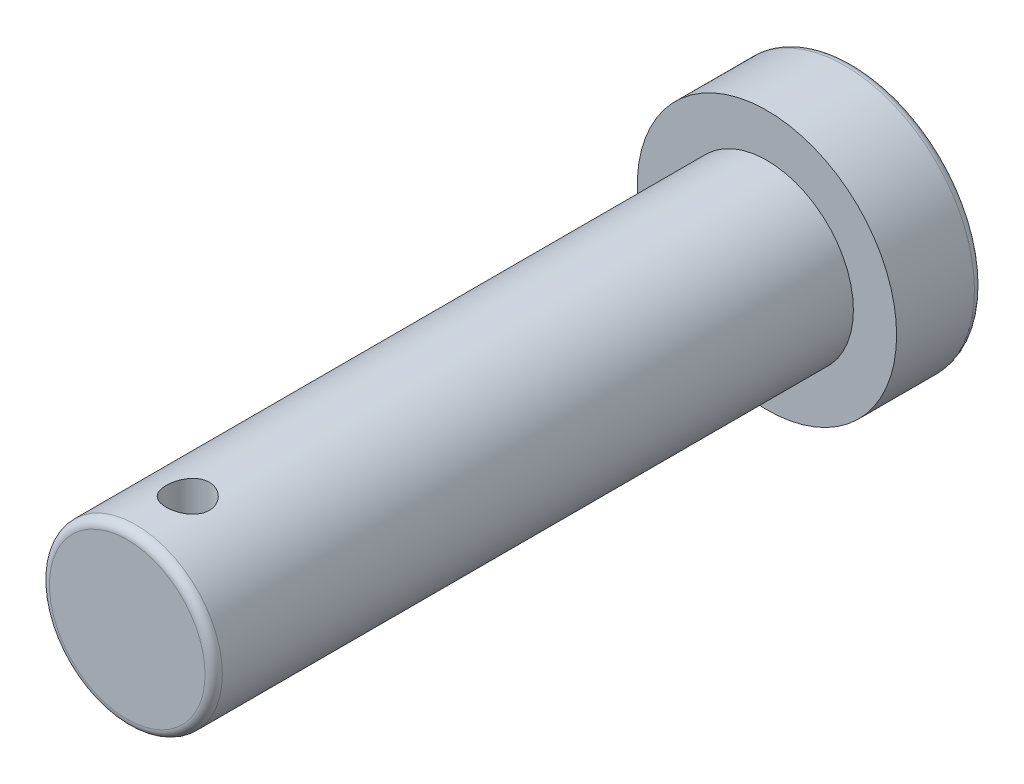
ISO-10303-21;
HEADER;
FILE_DESCRIPTION(('STEP AP214'),'2;1');
FILE_NAME('part.step','',(''),(''),'','','');
FILE_SCHEMA(('AUTOMOTIVE_DESIGN { 1 0 10303 214 1 1 1 1 }'));
ENDSEC;
DATA;
#1=APPLICATION_CONTEXT('core data for automotive mechanical design processes');
#2=APPLICATION_PROTOCOL_DEFINITION('international standard','automotive_design',2000,#1);
#3=PRODUCT_CONTEXT('',#1,'mechanical');
#4=PRODUCT('Part','Part','',(#3));
#5=PRODUCT_RELATED_PRODUCT_CATEGORY('part','',(#4));
#6=PRODUCT_DEFINITION_FORMATION('','',#4);
#7=PRODUCT_DEFINITION_CONTEXT('part definition',#1,'design');
#8=PRODUCT_DEFINITION('design','',#6,#7);
#9=PRODUCT_DEFINITION_SHAPE('','',#8);
#10=(LENGTH_UNIT() NAMED_UNIT(*) SI_UNIT(.MILLI.,.METRE.));
#11=(NAMED_UNIT(*) PLANE_ANGLE_UNIT() SI_UNIT($,.RADIAN.));
#12=(NAMED_UNIT(*) SI_UNIT($,.STERADIAN.) SOLID_ANGLE_UNIT());
#13=UNCERTAINTY_MEASURE_WITH_UNIT(LENGTH_MEASURE(1.E-05),#10,'distance_accuracy_value','');
#14=(GEOMETRIC_REPRESENTATION_CONTEXT(3) GLOBAL_UNCERTAINTY_ASSIGNED_CONTEXT((#13)) GLOBAL_UNIT_ASSIGNED_CONTEXT((#10,
#11,#12)) REPRESENTATION_CONTEXT('',''));
#15=CARTESIAN_POINT('',(0.,0.,0.));
#16=DIRECTION('',(0.,0.,1.));
#17=DIRECTION('',(1.,0.,0.));
#18=AXIS2_PLACEMENT_3D('',#15,#16,#17);
#19=CARTESIAN_POINT('',(0.,0.,84.));
#20=DIRECTION('',(0.,0.,-1.));
#21=DIRECTION('',(-1.,0.,0.));
#22=AXIS2_PLACEMENT_3D('',#19,#20,#21);
#23=CYLINDRICAL_SURFACE('',#22,10.);
#24=CARTESIAN_POINT('',(0.,0.,83.));
#25=DIRECTION('',(0.,0.,1.));
#26=DIRECTION('',(1.,0.,0.));
#27=AXIS2_PLACEMENT_3D('',#24,#25,#26);
#28=CIRCLE('',#27,10.);
#29=CARTESIAN_POINT('',(10.,0.,83.));
#30=VERTEX_POINT('',#29);
#31=EDGE_CURVE('E10',#30,#30,#28,.F.);
#32=ORIENTED_EDGE('',*,*,#31,.T.);
#33=EDGE_LOOP('',(#32));
#34=FACE_BOUND('',#33,.T.);
#35=CARTESIAN_POINT('',(0.,0.,10.));
#36=DIRECTION('',(0.,0.,1.));
#37=DIRECTION('',(1.,0.,0.));
#38=AXIS2_PLACEMENT_3D('',#35,#36,#37);
#39=CIRCLE('',#38,10.);
#40=CARTESIAN_POINT('',(10.,0.,10.));
#41=VERTEX_POINT('',#40);
#42=EDGE_CURVE('E50',#41,#41,#39,.T.);
#43=ORIENTED_EDGE('',*,*,#42,.T.);
#44=EDGE_LOOP('',(#43));
#45=FACE_BOUND('',#44,.T.);
#46=CARTESIAN_POINT('',(0.,-10.,74.5));
#47=CARTESIAN_POINT('',(0.138126814449552,-9.99999766446687,74.5000038762303));
#48=CARTESIAN_POINT('',(0.276296929717938,-9.99710963553044,74.5114859179563));
#49=CARTESIAN_POINT('',(0.548677206284221,-9.98586856383157,74.557041918845));
#50=CARTESIAN_POINT('',(0.682885078117899,-9.97751242366627,74.5911286825631));
#51=CARTESIAN_POINT('',(0.943368120304294,-9.9562604388672,74.6807320891035));
#52=CARTESIAN_POINT('',(1.06965260571667,-9.94337004736764,74.7362229978588));
#53=CARTESIAN_POINT('',(1.31112021984071,-9.91442239679369,74.8669689834081));
#54=CARTESIAN_POINT('',(1.4263029739146,-9.89836503090261,74.942224726865));
#55=CARTESIAN_POINT('',(1.64466987883486,-9.86445689319489,75.1120013160903));
#56=CARTESIAN_POINT('',(1.74759281676843,-9.84657845246877,75.2068526249318));
#57=CARTESIAN_POINT('',(1.93624821200553,-9.81122700196561,75.4124203415151));
#58=CARTESIAN_POINT('',(2.02197872824865,-9.79375403816446,75.5231385382449));
#59=CARTESIAN_POINT('',(2.17504423799829,-9.76091292830281,75.759325377895));
#60=CARTESIAN_POINT('',(2.2420870265419,-9.74557990774685,75.8849887180146));
#61=CARTESIAN_POINT('',(2.35399484758457,-9.71915824696694,76.1462473527667));
#62=CARTESIAN_POINT('',(2.39886342573357,-9.70806892824031,76.2818410555534));
#63=CARTESIAN_POINT('',(2.46425806134127,-9.69167461160538,76.5562391636694));
#64=CARTESIAN_POINT('',(2.48525378055342,-9.68625818328352,76.69492482673));
#65=CARTESIAN_POINT('',(2.50376962511068,-9.68148937432652,76.9739476149989));
#66=CARTESIAN_POINT('',(2.50129356969685,-9.68213600713214,77.1142844678202));
#67=CARTESIAN_POINT('',(2.47331087439951,-9.68932009194695,77.3890263462423));
#68=CARTESIAN_POINT('',(2.44836390031773,-9.69571438345489,77.5234927024422));
#69=CARTESIAN_POINT('',(2.37704031150499,-9.71344516118448,77.7862684181851));
#70=CARTESIAN_POINT('',(2.33066217011565,-9.72478199948731,77.9145773383816));
#71=CARTESIAN_POINT('',(2.21731579656197,-9.75125189842765,78.1628966937536));
#72=CARTESIAN_POINT('',(2.1501444453882,-9.76642212449693,78.282810286316));
#73=CARTESIAN_POINT('',(1.99726046002491,-9.79882851409985,78.5098645162614));
#74=CARTESIAN_POINT('',(1.91154458134807,-9.81606503891047,78.6170029134454));
#75=CARTESIAN_POINT('',(1.72110570780204,-9.85126467566485,78.818672692824));
#76=CARTESIAN_POINT('',(1.61591043027644,-9.86923449130001,78.9127574834356));
#77=CARTESIAN_POINT('',(1.39101986250617,-9.90343275964594,79.0820354041065));
#78=CARTESIAN_POINT('',(1.27132412951325,-9.91966115915679,79.157227957106));
#79=CARTESIAN_POINT('',(1.02019314780233,-9.94862886823651,79.2867509770407));
#80=CARTESIAN_POINT('',(0.88871898868105,-9.96135600212878,79.3410089004241));
#81=CARTESIAN_POINT('',(0.618126680238147,-9.98179861652361,79.4265288428493));
#82=CARTESIAN_POINT('',(0.479009998584146,-9.98951505565468,79.4577952606969));
#83=CARTESIAN_POINT('',(0.200899950650046,-9.99892498785624,79.4957626092647));
#84=CARTESIAN_POINT('',(0.0619945333136843,-10.0007675584713,79.5030717101255));
#85=CARTESIAN_POINT('',(-0.215054791335847,-9.99864674690754,79.4945849965742));
#86=CARTESIAN_POINT('',(-0.353198766074327,-9.99468388736421,79.4787912620015));
#87=CARTESIAN_POINT('',(-0.622690447960819,-9.98149301878918,79.4250484860144));
#88=CARTESIAN_POINT('',(-0.754108531614586,-9.97234390309647,79.3874312275384));
#89=CARTESIAN_POINT('',(-1.00876215408753,-9.94981177723595,79.2914881932859));
#90=CARTESIAN_POINT('',(-1.13199686505442,-9.93642833949965,79.2331603261447));
#91=CARTESIAN_POINT('',(-1.36920522404972,-9.9065551321037,79.0962731185422));
#92=CARTESIAN_POINT('',(-1.48297573639295,-9.89001445610999,79.0173731460058));
#93=CARTESIAN_POINT('',(-1.69587768940552,-9.85574181979587,78.8420168186714));
#94=CARTESIAN_POINT('',(-1.79500659828875,-9.83800965421578,78.7455574339706));
#95=CARTESIAN_POINT('',(-1.97831761345414,-9.80281594932498,78.5349967319272));
#96=CARTESIAN_POINT('',(-2.06207311270184,-9.78537173637463,78.4205204950008));
#97=CARTESIAN_POINT('',(-2.20918459835605,-9.75321463970069,78.1787789425524));
#98=CARTESIAN_POINT('',(-2.27254149026901,-9.73850163474941,78.0515141950493));
#99=CARTESIAN_POINT('',(-2.37658570101223,-9.71363491194665,77.7884904626563));
#100=CARTESIAN_POINT('',(-2.41740732773931,-9.70345425375809,77.6527872861462));
#101=CARTESIAN_POINT('',(-2.47557609990489,-9.68877906706585,77.3761506035745));
#102=CARTESIAN_POINT('',(-2.49292837912652,-9.68428329504044,77.2352182482976));
#103=CARTESIAN_POINT('',(-2.50339765056083,-9.68158168701612,76.9564649602307));
#104=CARTESIAN_POINT('',(-2.49719649630131,-9.68319887888035,76.818670941456));
#105=CARTESIAN_POINT('',(-2.46229546385366,-9.69213181672143,76.5461601855562));
#106=CARTESIAN_POINT('',(-2.43359603781098,-9.69944744817731,76.4114433866447));
#107=CARTESIAN_POINT('',(-2.35488553240495,-9.71885434473222,76.1496525682236));
#108=CARTESIAN_POINT('',(-2.30500234113404,-9.73091692061057,76.0225378245995));
#109=CARTESIAN_POINT('',(-2.18544152267504,-9.7584625954084,75.7783910288107));
#110=CARTESIAN_POINT('',(-2.11576115005696,-9.77394616867808,75.6613603780219));
#111=CARTESIAN_POINT('',(-1.95644624772858,-9.80709390439337,75.4374089516633));
#112=CARTESIAN_POINT('',(-1.86633860485376,-9.82480441386302,75.3308315442934));
#113=CARTESIAN_POINT('',(-1.66964895198288,-9.86013378743769,75.1340882586744));
#114=CARTESIAN_POINT('',(-1.56306303543524,-9.87775262878422,75.0439262831451));
#115=CARTESIAN_POINT('',(-1.33411264450432,-9.91129426079449,74.8809811523924));
#116=CARTESIAN_POINT('',(-1.21149737052731,-9.92718055609783,74.8085423105474));
#117=CARTESIAN_POINT('',(-0.955443432517457,-9.95508208291861,74.6854208950992));
#118=CARTESIAN_POINT('',(-0.822012605727899,-9.96710008666302,74.6347227322525));
#119=CARTESIAN_POINT('',(-0.57401708873912,-9.98413432609236,74.5640469494506));
#120=CARTESIAN_POINT('',(-0.460633618180114,-9.99004308421151,74.5400812615776));
#121=CARTESIAN_POINT('',(-0.231510119227138,-9.9979767538658,74.5080567606301));
#122=CARTESIAN_POINT('',(-0.115770268737694,-10.0000019575149,74.4999967511579));
#123=CARTESIAN_POINT('',(0.,-10.,74.5));
#124=B_SPLINE_CURVE_WITH_KNOTS('',3,(#46,#47,#48,#49,#50,#51,#52,#53,#54,#55,#56,#57,#58,#59,
#60,#61,#62,#63,#64,#65,#66,#67,#68,#69,#70,#71,#72,#73,#74,#75,#76,#77,#78,#79,#80,#81,#82,#83,
#84,#85,#86,#87,#88,#89,#90,#91,#92,#93,#94,#95,#96,#97,#98,#99,#100,#101,#102,#103,#104,#105,
#106,#107,#108,#109,#110,#111,#112,#113,#114,#115,#116,#117,#118,#119,#120,#121,#122,#123),
.UNSPECIFIED.,.T.,.F.,(4,2,2,2,2,2,2,2,2,2,2,2,2,2,2,2,2,2,2,2,2,2,2,2,2,2,2,2,2,2,2,2,2,2,2,2,
2,2,4),(0.,0.41395618745315,0.828147062939832,1.24184150381017,1.65554990028221,
2.07690725728565,2.49831215966769,2.92597745909677,3.3535743528228,3.77260491835115,
4.19156730193361,4.60037495017229,5.00921172448933,5.42217546462,5.83521151399137,
6.26002501620565,6.68485149269279,7.11113715020723,7.53734122819939,7.95263848254328,
8.36789835193439,8.7770045752893,9.18615212209352,9.60255979281122,10.0190393835223,
10.4457418201299,10.8724253125471,11.2965375769764,11.7205570543048,12.1323963400748,
12.5442273493652,12.9536066760887,13.3630428023797,13.7831596069298,14.2033761629383,
14.6312030917578,15.0587227304538,15.4057040491338,15.752659267482),.UNSPECIFIED.);
#125=CARTESIAN_POINT('',(0.,-10.,74.5));
#126=VERTEX_POINT('',#125);
#127=EDGE_CURVE('E60',#126,#126,#124,.T.);
#128=ORIENTED_EDGE('',*,*,#127,.F.);
#129=EDGE_LOOP('',(#128));
#130=FACE_BOUND('',#129,.T.);
#131=CARTESIAN_POINT('',(0.,10.,74.5));
#132=CARTESIAN_POINT('',(-0.138126814449552,9.99999766446687,74.5000038762303));
#133=CARTESIAN_POINT('',(-0.276296929717938,9.99710963553044,74.5114859179563));
#134=CARTESIAN_POINT('',(-0.548677206284221,9.98586856383157,74.557041918845));
#135=CARTESIAN_POINT('',(-0.682885078117899,9.97751242366627,74.5911286825631));
#136=CARTESIAN_POINT('',(-0.943368120304294,9.9562604388672,74.6807320891035));
#137=CARTESIAN_POINT('',(-1.06965260571667,9.94337004736764,74.7362229978588));
#138=CARTESIAN_POINT('',(-1.31112021984071,9.91442239679369,74.8669689834081));
#139=CARTESIAN_POINT('',(-1.4263029739146,9.89836503090261,74.942224726865));
#140=CARTESIAN_POINT('',(-1.64466987883486,9.86445689319489,75.1120013160903));
#141=CARTESIAN_POINT('',(-1.74759281676843,9.84657845246877,75.2068526249318));
#142=CARTESIAN_POINT('',(-1.93624821200553,9.81122700196561,75.4124203415151));
#143=CARTESIAN_POINT('',(-2.02197872824865,9.79375403816446,75.5231385382449));
#144=CARTESIAN_POINT('',(-2.17504423799829,9.76091292830281,75.759325377895));
#145=CARTESIAN_POINT('',(-2.2420870265419,9.74557990774685,75.8849887180146));
#146=CARTESIAN_POINT('',(-2.35399484758457,9.71915824696694,76.1462473527667));
#147=CARTESIAN_POINT('',(-2.39886342573357,9.70806892824031,76.2818410555534));
#148=CARTESIAN_POINT('',(-2.46425806134127,9.69167461160538,76.5562391636694));
#149=CARTESIAN_POINT('',(-2.48525378055342,9.68625818328352,76.69492482673));
#150=CARTESIAN_POINT('',(-2.50376962511068,9.68148937432652,76.9739476149989));
#151=CARTESIAN_POINT('',(-2.50129356969685,9.68213600713214,77.1142844678202));
#152=CARTESIAN_POINT('',(-2.47331087439951,9.68932009194695,77.3890263462423));
#153=CARTESIAN_POINT('',(-2.44836390031773,9.69571438345489,77.5234927024422));
#154=CARTESIAN_POINT('',(-2.37704031150499,9.71344516118448,77.7862684181851));
#155=CARTESIAN_POINT('',(-2.33066217011565,9.72478199948731,77.9145773383816));
#156=CARTESIAN_POINT('',(-2.21731579656197,9.75125189842765,78.1628966937536));
#157=CARTESIAN_POINT('',(-2.1501444453882,9.76642212449693,78.282810286316));
#158=CARTESIAN_POINT('',(-1.99726046002491,9.79882851409985,78.5098645162614));
#159=CARTESIAN_POINT('',(-1.91154458134807,9.81606503891047,78.6170029134454));
#160=CARTESIAN_POINT('',(-1.72110570780204,9.85126467566485,78.818672692824));
#161=CARTESIAN_POINT('',(-1.61591043027644,9.86923449130001,78.9127574834356));
#162=CARTESIAN_POINT('',(-1.39101986250617,9.90343275964594,79.0820354041065));
#163=CARTESIAN_POINT('',(-1.27132412951325,9.91966115915679,79.157227957106));
#164=CARTESIAN_POINT('',(-1.02019314780233,9.94862886823651,79.2867509770407));
#165=CARTESIAN_POINT('',(-0.88871898868105,9.96135600212878,79.3410089004241));
#166=CARTESIAN_POINT('',(-0.618126680238147,9.98179861652361,79.4265288428493));
#167=CARTESIAN_POINT('',(-0.479009998584146,9.98951505565468,79.4577952606969));
#168=CARTESIAN_POINT('',(-0.200899950650046,9.99892498785624,79.4957626092647));
#169=CARTESIAN_POINT('',(-0.0619945333136843,10.0007675584713,79.5030717101255));
#170=CARTESIAN_POINT('',(0.215054791335847,9.99864674690754,79.4945849965742));
#171=CARTESIAN_POINT('',(0.353198766074327,9.99468388736421,79.4787912620015));
#172=CARTESIAN_POINT('',(0.622690447960819,9.98149301878918,79.4250484860144));
#173=CARTESIAN_POINT('',(0.754108531614586,9.97234390309647,79.3874312275384));
#174=CARTESIAN_POINT('',(1.00876215408753,9.94981177723595,79.2914881932859));
#175=CARTESIAN_POINT('',(1.13199686505442,9.93642833949965,79.2331603261447));
#176=CARTESIAN_POINT('',(1.36920522404972,9.9065551321037,79.0962731185422));
#177=CARTESIAN_POINT('',(1.48297573639295,9.89001445610999,79.0173731460058));
#178=CARTESIAN_POINT('',(1.69587768940552,9.85574181979587,78.8420168186714));
#179=CARTESIAN_POINT('',(1.79500659828875,9.83800965421578,78.7455574339706));
#180=CARTESIAN_POINT('',(1.97831761345414,9.80281594932498,78.5349967319272));
#181=CARTESIAN_POINT('',(2.06207311270184,9.78537173637463,78.4205204950008));
#182=CARTESIAN_POINT('',(2.20918459835605,9.75321463970069,78.1787789425524));
#183=CARTESIAN_POINT('',(2.27254149026901,9.73850163474941,78.0515141950493));
#184=CARTESIAN_POINT('',(2.37658570101223,9.71363491194665,77.7884904626563));
#185=CARTESIAN_POINT('',(2.41740732773931,9.70345425375809,77.6527872861462));
#186=CARTESIAN_POINT('',(2.47557609990489,9.68877906706585,77.3761506035745));
#187=CARTESIAN_POINT('',(2.49292837912652,9.68428329504044,77.2352182482976));
#188=CARTESIAN_POINT('',(2.50339765056083,9.68158168701612,76.9564649602307));
#189=CARTESIAN_POINT('',(2.49719649630131,9.68319887888035,76.818670941456));
#190=CARTESIAN_POINT('',(2.46229546385366,9.69213181672143,76.5461601855562));
#191=CARTESIAN_POINT('',(2.43359603781098,9.69944744817731,76.4114433866447));
#192=CARTESIAN_POINT('',(2.35488553240495,9.71885434473222,76.1496525682236));
#193=CARTESIAN_POINT('',(2.30500234113404,9.73091692061057,76.0225378245995));
#194=CARTESIAN_POINT('',(2.18544152267504,9.7584625954084,75.7783910288107));
#195=CARTESIAN_POINT('',(2.11576115005696,9.77394616867808,75.6613603780219));
#196=CARTESIAN_POINT('',(1.95644624772858,9.80709390439337,75.4374089516633));
#197=CARTESIAN_POINT('',(1.86633860485376,9.82480441386302,75.3308315442934));
#198=CARTESIAN_POINT('',(1.66964895198288,9.86013378743769,75.1340882586744));
#199=CARTESIAN_POINT('',(1.56306303543524,9.87775262878422,75.0439262831451));
#200=CARTESIAN_POINT('',(1.33411264450432,9.91129426079449,74.8809811523924));
#201=CARTESIAN_POINT('',(1.21149737052731,9.92718055609783,74.8085423105474));
#202=CARTESIAN_POINT('',(0.955443432517457,9.95508208291861,74.6854208950992));
#203=CARTESIAN_POINT('',(0.822012605727899,9.96710008666302,74.6347227322525));
#204=CARTESIAN_POINT('',(0.57401708873912,9.98413432609236,74.5640469494506));
#205=CARTESIAN_POINT('',(0.460633618180114,9.99004308421151,74.5400812615776));
#206=CARTESIAN_POINT('',(0.231510119227138,9.9979767538658,74.5080567606301));
#207=CARTESIAN_POINT('',(0.115770268737694,10.0000019575149,74.4999967511579));
#208=CARTESIAN_POINT('',(0.,10.,74.5));
#209=B_SPLINE_CURVE_WITH_KNOTS('',3,(#131,#132,#133,#134,#135,#136,#137,#138,#139,#140,#141,
#142,#143,#144,#145,#146,#147,#148,#149,#150,#151,#152,#153,#154,#155,#156,#157,#158,#159,#160,
#161,#162,#163,#164,#165,#166,#167,#168,#169,#170,#171,#172,#173,#174,#175,#176,#177,#178,#179,
#180,#181,#182,#183,#184,#185,#186,#187,#188,#189,#190,#191,#192,#193,#194,#195,#196,#197,#198,
#199,#200,#201,#202,#203,#204,#205,#206,#207,#208),.UNSPECIFIED.,.T.,.F.,(4,2,2,2,2,2,2,2,2,2,2,
2,2,2,2,2,2,2,2,2,2,2,2,2,2,2,2,2,2,2,2,2,2,2,2,2,2,2,4),(0.,0.41395618745315,0.828147062939832,
1.24184150381017,1.65554990028221,2.07690725728565,2.49831215966769,2.92597745909677,
3.3535743528228,3.77260491835115,4.19156730193361,4.60037495017229,5.00921172448933,
5.42217546462,5.83521151399137,6.26002501620565,6.68485149269279,7.11113715020723,
7.53734122819939,7.95263848254328,8.36789835193439,8.7770045752893,9.18615212209352,
9.60255979281122,10.0190393835223,10.4457418201299,10.8724253125471,11.2965375769764,
11.7205570543048,12.1323963400748,12.5442273493652,12.9536066760887,13.3630428023797,
13.7831596069298,14.2033761629383,14.6312030917578,15.0587227304538,15.4057040491338,
15.752659267482),.UNSPECIFIED.);
#210=CARTESIAN_POINT('',(0.,10.,74.5));
#211=VERTEX_POINT('',#210);
#212=EDGE_CURVE('E51',#211,#211,#209,.T.);
#213=ORIENTED_EDGE('',*,*,#212,.F.);
#214=EDGE_LOOP('',(#213));
#215=FACE_BOUND('',#214,.T.);
#216=ADVANCED_FACE('F30',(#34,#45,#130,#215),#23,.T.);
#217=CARTESIAN_POINT('',(0.,0.,10.));
#218=DIRECTION('',(0.,0.,-1.));
#219=DIRECTION('',(-1.,0.,0.));
#220=AXIS2_PLACEMENT_3D('',#217,#218,#219);
#221=CYLINDRICAL_SURFACE('',#220,15.);
#222=CARTESIAN_POINT('',(0.,0.,0.999999999999999));
#223=DIRECTION('',(0.,0.,1.));
#224=DIRECTION('',(1.,0.,0.));
#225=AXIS2_PLACEMENT_3D('',#222,#223,#224);
#226=CIRCLE('',#225,15.);
#227=CARTESIAN_POINT('',(15.,0.,0.999999999999999));
#228=VERTEX_POINT('',#227);
#229=EDGE_CURVE('E45',#228,#228,#226,.T.);
#230=ORIENTED_EDGE('',*,*,#229,.T.);
#231=EDGE_LOOP('',(#230));
#232=FACE_BOUND('',#231,.T.);
#233=CARTESIAN_POINT('',(0.,0.,10.));
#234=DIRECTION('',(0.,0.,1.));
#235=DIRECTION('',(1.,0.,0.));
#236=AXIS2_PLACEMENT_3D('',#233,#234,#235);
#237=CIRCLE('',#236,15.);
#238=CARTESIAN_POINT('',(15.,0.,10.));
#239=VERTEX_POINT('',#238);
#240=EDGE_CURVE('E59',#239,#239,#237,.T.);
#241=ORIENTED_EDGE('',*,*,#240,.F.);
#242=EDGE_LOOP('',(#241));
#243=FACE_BOUND('',#242,.T.);
#244=ADVANCED_FACE('F84',(#232,#243),#221,.T.);
#245=CARTESIAN_POINT('',(0.,0.,10.));
#246=DIRECTION('',(0.,0.,1.));
#247=DIRECTION('',(1.,0.,0.));
#248=AXIS2_PLACEMENT_3D('',#245,#246,#247);
#249=PLANE('',#248);
#250=ORIENTED_EDGE('',*,*,#42,.F.);
#251=EDGE_LOOP('',(#250));
#252=FACE_BOUND('',#251,.T.);
#253=ORIENTED_EDGE('',*,*,#240,.T.);
#254=EDGE_LOOP('',(#253));
#255=FACE_BOUND('',#254,.T.);
#256=ADVANCED_FACE('F80',(#252,#255),#249,.T.);
#257=CARTESIAN_POINT('',(0.,0.,0.));
#258=DIRECTION('',(0.,0.,1.));
#259=DIRECTION('',(1.,0.,0.));
#260=AXIS2_PLACEMENT_3D('',#257,#258,#259);
#261=PLANE('',#260);
#262=CARTESIAN_POINT('',(0.,0.,0.));
#263=DIRECTION('',(0.,0.,1.));
#264=DIRECTION('',(1.,0.,0.));
#265=AXIS2_PLACEMENT_3D('',#262,#263,#264);
#266=CIRCLE('',#265,14.);
#267=CARTESIAN_POINT('',(14.,0.,0.));
#268=VERTEX_POINT('',#267);
#269=EDGE_CURVE('E41',#268,#268,#266,.F.);
#270=ORIENTED_EDGE('',*,*,#269,.T.);
#271=EDGE_LOOP('',(#270));
#272=FACE_BOUND('',#271,.T.);
#273=ADVANCED_FACE('F76',(#272),#261,.F.);
#274=CARTESIAN_POINT('',(0.,0.,84.));
#275=DIRECTION('',(0.,0.,1.));
#276=DIRECTION('',(1.,0.,0.));
#277=AXIS2_PLACEMENT_3D('',#274,#275,#276);
#278=PLANE('',#277);
#279=CARTESIAN_POINT('',(0.,0.,84.));
#280=DIRECTION('',(0.,0.,1.));
#281=DIRECTION('',(1.,0.,0.));
#282=AXIS2_PLACEMENT_3D('',#279,#280,#281);
#283=CIRCLE('',#282,9.);
#284=CARTESIAN_POINT('',(9.,0.,84.));
#285=VERTEX_POINT('',#284);
#286=EDGE_CURVE('E37',#285,#285,#283,.T.);
#287=ORIENTED_EDGE('',*,*,#286,.T.);
#288=EDGE_LOOP('',(#287));
#289=FACE_BOUND('',#288,.T.);
#290=ADVANCED_FACE('F72',(#289),#278,.T.);
#291=CARTESIAN_POINT('',(0.,74.,77.));
#292=DIRECTION('',(0.,-1.,0.));
#293=DIRECTION('',(0.,0.,-1.));
#294=AXIS2_PLACEMENT_3D('',#291,#292,#293);
#295=CYLINDRICAL_SURFACE('',#294,2.5);
#296=ORIENTED_EDGE('',*,*,#127,.T.);
#297=EDGE_LOOP('',(#296));
#298=FACE_BOUND('',#297,.T.);
#299=ORIENTED_EDGE('',*,*,#212,.T.);
#300=EDGE_LOOP('',(#299));
#301=FACE_BOUND('',#300,.T.);
#302=ADVANCED_FACE('F68',(#298,#301),#295,.F.);
#303=CARTESIAN_POINT('',(0.,0.,0.999999999999999));
#304=DIRECTION('',(0.,0.,1.));
#305=DIRECTION('',(1.,0.,0.));
#306=AXIS2_PLACEMENT_3D('',#303,#304,#305);
#307=TOROIDAL_SURFACE('',#306,14.,1.);
#308=ORIENTED_EDGE('',*,*,#269,.F.);
#309=EDGE_LOOP('',(#308));
#310=FACE_BOUND('',#309,.T.);
#311=ORIENTED_EDGE('',*,*,#229,.F.);
#312=EDGE_LOOP('',(#311));
#313=FACE_BOUND('',#312,.T.);
#314=ADVANCED_FACE('F71',(#310,#313),#307,.T.);
#315=CARTESIAN_POINT('',(0.,0.,83.));
#316=DIRECTION('',(0.,0.,1.));
#317=DIRECTION('',(1.,0.,0.));
#318=AXIS2_PLACEMENT_3D('',#315,#316,#317);
#319=TOROIDAL_SURFACE('',#318,9.,1.);
#320=ORIENTED_EDGE('',*,*,#31,.F.);
#321=EDGE_LOOP('',(#320));
#322=FACE_BOUND('',#321,.T.);
#323=ORIENTED_EDGE('',*,*,#286,.F.);
#324=EDGE_LOOP('',(#323));
#325=FACE_BOUND('',#324,.T.);
#326=ADVANCED_FACE('F32',(#322,#325),#319,.T.);
#327=CLOSED_SHELL('',(#216,#244,#256,#273,#290,#302,#314,#326));
#328=MANIFOLD_SOLID_BREP('B2',#327);
#329=ADVANCED_BREP_SHAPE_REPRESENTATION('',(#18,#328),#14);
#330=SHAPE_DEFINITION_REPRESENTATION(#9,#329);
ENDSEC;
END-ISO-10303-21;
